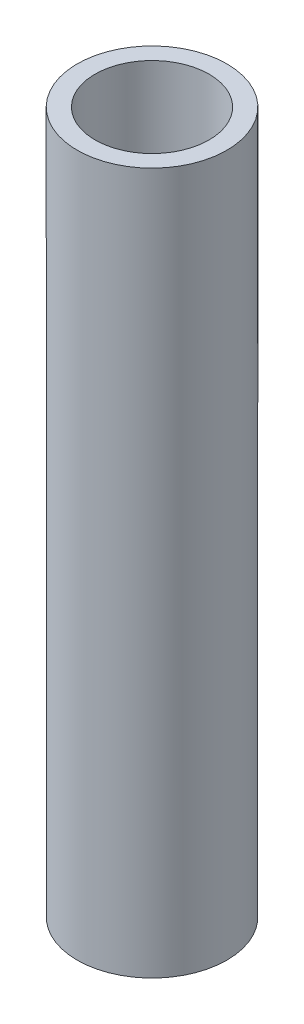
ISO-10303-21;
HEADER;
FILE_DESCRIPTION(('STEP AP214'),'2;1');
FILE_NAME('part.step','',(''),(''),'','','');
FILE_SCHEMA(('AUTOMOTIVE_DESIGN { 1 0 10303 214 1 1 1 1 }'));
ENDSEC;
DATA;
#1=APPLICATION_CONTEXT('core data for automotive mechanical design processes');
#2=APPLICATION_PROTOCOL_DEFINITION('international standard','automotive_design',2000,#1);
#3=PRODUCT_CONTEXT('',#1,'mechanical');
#4=PRODUCT('Part','Part','',(#3));
#5=PRODUCT_RELATED_PRODUCT_CATEGORY('part','',(#4));
#6=PRODUCT_DEFINITION_FORMATION('','',#4);
#7=PRODUCT_DEFINITION_CONTEXT('part definition',#1,'design');
#8=PRODUCT_DEFINITION('design','',#6,#7);
#9=PRODUCT_DEFINITION_SHAPE('','',#8);
#10=(LENGTH_UNIT() NAMED_UNIT(*) SI_UNIT(.MILLI.,.METRE.));
#11=(NAMED_UNIT(*) PLANE_ANGLE_UNIT() SI_UNIT($,.RADIAN.));
#12=(NAMED_UNIT(*) SI_UNIT($,.STERADIAN.) SOLID_ANGLE_UNIT());
#13=UNCERTAINTY_MEASURE_WITH_UNIT(LENGTH_MEASURE(1.E-05),#10,'distance_accuracy_value','');
#14=(GEOMETRIC_REPRESENTATION_CONTEXT(3) GLOBAL_UNCERTAINTY_ASSIGNED_CONTEXT((#13)) GLOBAL_UNIT_ASSIGNED_CONTEXT((#10,
#11,#12)) REPRESENTATION_CONTEXT('',''));
#15=CARTESIAN_POINT('',(0.,0.,0.));
#16=DIRECTION('',(0.,0.,1.));
#17=DIRECTION('',(1.,0.,0.));
#18=AXIS2_PLACEMENT_3D('',#15,#16,#17);
#19=CARTESIAN_POINT('',(0.,0.,0.));
#20=DIRECTION('',(0.,1.,0.));
#21=DIRECTION('',(0.,0.,1.));
#22=AXIS2_PLACEMENT_3D('',#19,#20,#21);
#23=PLANE('',#22);
#24=CARTESIAN_POINT('',(0.,0.,0.));
#25=DIRECTION('',(0.,1.,0.));
#26=DIRECTION('',(0.,0.,1.));
#27=AXIS2_PLACEMENT_3D('',#24,#25,#26);
#28=CIRCLE('',#27,1.05);
#29=CARTESIAN_POINT('',(0.,0.,1.05));
#30=VERTEX_POINT('',#29);
#31=EDGE_CURVE('E44',#30,#30,#28,.T.);
#32=ORIENTED_EDGE('',*,*,#31,.F.);
#33=EDGE_LOOP('',(#32));
#34=FACE_BOUND('',#33,.T.);
#35=CARTESIAN_POINT('',(0.,0.,0.));
#36=DIRECTION('',(0.,1.,0.));
#37=DIRECTION('',(0.,0.,1.));
#38=AXIS2_PLACEMENT_3D('',#35,#36,#37);
#39=CIRCLE('',#38,0.8);
#40=CARTESIAN_POINT('',(0.,0.,0.8));
#41=VERTEX_POINT('',#40);
#42=EDGE_CURVE('E53',#41,#41,#39,.T.);
#43=ORIENTED_EDGE('',*,*,#42,.T.);
#44=EDGE_LOOP('',(#43));
#45=FACE_BOUND('',#44,.T.);
#46=ADVANCED_FACE('F37',(#34,#45),#23,.F.);
#47=CARTESIAN_POINT('',(0.,17.810885557106,0.));
#48=DIRECTION('',(0.,-1.,0.));
#49=DIRECTION('',(0.,0.,-1.));
#50=AXIS2_PLACEMENT_3D('',#47,#48,#49);
#51=CYLINDRICAL_SURFACE('',#50,1.05);
#52=CARTESIAN_POINT('',(0.,9.84103707612249,0.));
#53=DIRECTION('',(0.,-1.,0.));
#54=DIRECTION('',(0.,0.,-1.));
#55=AXIS2_PLACEMENT_3D('',#52,#53,#54);
#56=CIRCLE('',#55,1.05);
#57=CARTESIAN_POINT('',(0.,9.84103707612249,-1.05));
#58=VERTEX_POINT('',#57);
#59=EDGE_CURVE('E48',#58,#58,#56,.T.);
#60=ORIENTED_EDGE('',*,*,#59,.T.);
#61=EDGE_LOOP('',(#60));
#62=FACE_BOUND('',#61,.T.);
#63=ORIENTED_EDGE('',*,*,#31,.T.);
#64=EDGE_LOOP('',(#63));
#65=FACE_BOUND('',#64,.T.);
#66=ADVANCED_FACE('F61',(#62,#65),#51,.T.);
#67=CARTESIAN_POINT('',(0.,17.810885557106,0.));
#68=DIRECTION('',(0.,-1.,0.));
#69=DIRECTION('',(0.,0.,-1.));
#70=AXIS2_PLACEMENT_3D('',#67,#68,#69);
#71=CYLINDRICAL_SURFACE('',#70,0.8);
#72=CARTESIAN_POINT('',(0.,9.84103707612249,0.));
#73=DIRECTION('',(0.,-1.,0.));
#74=DIRECTION('',(0.,0.,-1.));
#75=AXIS2_PLACEMENT_3D('',#72,#73,#74);
#76=CIRCLE('',#75,0.8);
#77=CARTESIAN_POINT('',(0.,9.84103707612249,-0.8));
#78=VERTEX_POINT('',#77);
#79=EDGE_CURVE('E11',#78,#78,#76,.T.);
#80=ORIENTED_EDGE('',*,*,#79,.F.);
#81=EDGE_LOOP('',(#80));
#82=FACE_BOUND('',#81,.T.);
#83=ORIENTED_EDGE('',*,*,#42,.F.);
#84=EDGE_LOOP('',(#83));
#85=FACE_BOUND('',#84,.T.);
#86=ADVANCED_FACE('F59',(#82,#85),#71,.F.);
#87=CARTESIAN_POINT('',(-1.17015654675444,9.84103707612249,5.47637961212403));
#88=DIRECTION('',(0.,-1.,0.));
#89=DIRECTION('',(-0.208956526206151,0.,0.977924930736434));
#90=AXIS2_PLACEMENT_3D('',#87,#88,#89);
#91=PLANE('',#90);
#92=ORIENTED_EDGE('',*,*,#79,.T.);
#93=EDGE_LOOP('',(#92));
#94=FACE_BOUND('',#93,.T.);
#95=ORIENTED_EDGE('',*,*,#59,.F.);
#96=EDGE_LOOP('',(#95));
#97=FACE_BOUND('',#96,.T.);
#98=ADVANCED_FACE('F39',(#94,#97),#91,.F.);
#99=CLOSED_SHELL('',(#46,#66,#86,#98));
#100=MANIFOLD_SOLID_BREP('B2',#99);
#101=ADVANCED_BREP_SHAPE_REPRESENTATION('',(#18,#100),#14);
#102=SHAPE_DEFINITION_REPRESENTATION(#9,#101);
ENDSEC;
END-ISO-10303-21;
